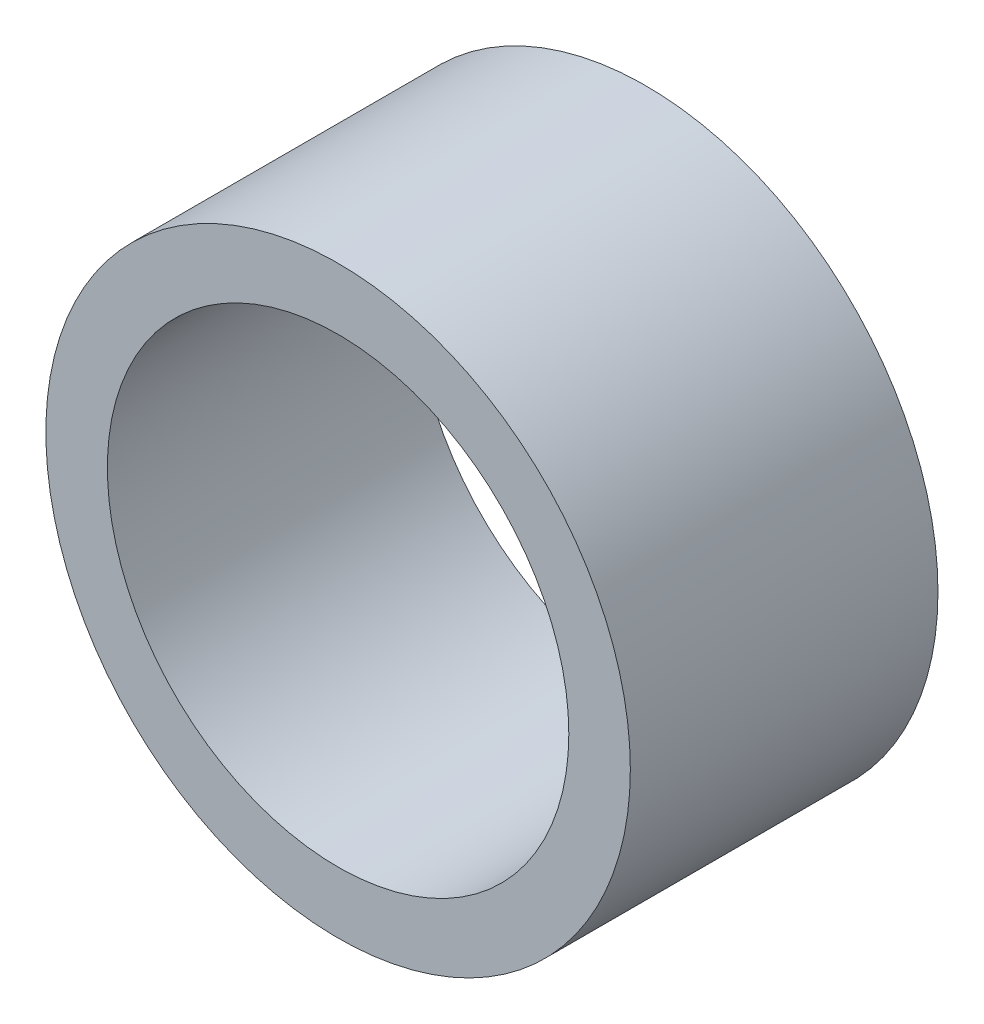
ISO-10303-21;
HEADER;
FILE_DESCRIPTION(('STEP AP214'),'2;1');
FILE_NAME('part.step','',(''),(''),'','','');
FILE_SCHEMA(('AUTOMOTIVE_DESIGN { 1 0 10303 214 1 1 1 1 }'));
ENDSEC;
DATA;
#1=APPLICATION_CONTEXT('core data for automotive mechanical design processes');
#2=APPLICATION_PROTOCOL_DEFINITION('international standard','automotive_design',2000,#1);
#3=PRODUCT_CONTEXT('',#1,'mechanical');
#4=PRODUCT('Part','Part','',(#3));
#5=PRODUCT_RELATED_PRODUCT_CATEGORY('part','',(#4));
#6=PRODUCT_DEFINITION_FORMATION('','',#4);
#7=PRODUCT_DEFINITION_CONTEXT('part definition',#1,'design');
#8=PRODUCT_DEFINITION('design','',#6,#7);
#9=PRODUCT_DEFINITION_SHAPE('','',#8);
#10=(LENGTH_UNIT() NAMED_UNIT(*) SI_UNIT(.MILLI.,.METRE.));
#11=(NAMED_UNIT(*) PLANE_ANGLE_UNIT() SI_UNIT($,.RADIAN.));
#12=(NAMED_UNIT(*) SI_UNIT($,.STERADIAN.) SOLID_ANGLE_UNIT());
#13=UNCERTAINTY_MEASURE_WITH_UNIT(LENGTH_MEASURE(1.E-05),#10,'distance_accuracy_value','');
#14=(GEOMETRIC_REPRESENTATION_CONTEXT(3) GLOBAL_UNCERTAINTY_ASSIGNED_CONTEXT((#13)) GLOBAL_UNIT_ASSIGNED_CONTEXT((#10,
#11,#12)) REPRESENTATION_CONTEXT('',''));
#15=CARTESIAN_POINT('',(0.,0.,0.));
#16=DIRECTION('',(0.,0.,1.));
#17=DIRECTION('',(1.,0.,0.));
#18=AXIS2_PLACEMENT_3D('',#15,#16,#17);
#19=CARTESIAN_POINT('',(0.,0.,-50.));
#20=DIRECTION('',(0.,0.,1.));
#21=DIRECTION('',(-1.,0.,0.));
#22=AXIS2_PLACEMENT_3D('',#19,#20,#21);
#23=CYLINDRICAL_SURFACE('',#22,7.5);
#24=CARTESIAN_POINT('',(0.,0.,0.));
#25=DIRECTION('',(0.,0.,-1.));
#26=DIRECTION('',(-1.,0.,0.));
#27=AXIS2_PLACEMENT_3D('',#24,#25,#26);
#28=CIRCLE('',#27,7.5);
#29=CARTESIAN_POINT('',(7.5,0.,0.));
#30=VERTEX_POINT('',#29);
#31=EDGE_CURVE('E61',#30,#30,#28,.T.);
#32=ORIENTED_EDGE('',*,*,#31,.T.);
#33=DIRECTION('',(0.,0.,1.));
#34=VECTOR('',#33,1.);
#35=CARTESIAN_POINT('',(7.5,0.,-50.));
#36=LINE('',#35,#34);
#37=CARTESIAN_POINT('',(7.5,0.,10.));
#38=VERTEX_POINT('',#37);
#39=EDGE_CURVE('E11',#30,#38,#36,.T.);
#40=ORIENTED_EDGE('',*,*,#39,.T.);
#41=CARTESIAN_POINT('',(0.,0.,10.));
#42=DIRECTION('',(0.,0.,-1.));
#43=DIRECTION('',(-1.,0.,0.));
#44=AXIS2_PLACEMENT_3D('',#41,#42,#43);
#45=CIRCLE('',#44,7.5);
#46=EDGE_CURVE('E25',#38,#38,#45,.T.);
#47=ORIENTED_EDGE('',*,*,#46,.F.);
#48=ORIENTED_EDGE('',*,*,#39,.F.);
#49=EDGE_LOOP('',(#32,#40,#47,#48));
#50=FACE_BOUND('',#49,.T.);
#51=ADVANCED_FACE('F17',(#50),#23,.F.);
#52=CARTESIAN_POINT('',(-9.5,0.,10.));
#53=DIRECTION('',(0.,0.,1.));
#54=DIRECTION('',(1.,0.,0.));
#55=AXIS2_PLACEMENT_3D('',#52,#53,#54);
#56=PLANE('',#55);
#57=ORIENTED_EDGE('',*,*,#46,.T.);
#58=EDGE_LOOP('',(#57));
#59=FACE_BOUND('',#58,.T.);
#60=CARTESIAN_POINT('',(0.,0.,10.));
#61=DIRECTION('',(0.,0.,-1.));
#62=DIRECTION('',(-1.,0.,0.));
#63=AXIS2_PLACEMENT_3D('',#60,#61,#62);
#64=CIRCLE('',#63,9.5);
#65=CARTESIAN_POINT('',(9.5,0.,10.));
#66=VERTEX_POINT('',#65);
#67=EDGE_CURVE('E57',#66,#66,#64,.T.);
#68=ORIENTED_EDGE('',*,*,#67,.F.);
#69=EDGE_LOOP('',(#68));
#70=FACE_BOUND('',#69,.T.);
#71=ADVANCED_FACE('F74',(#59,#70),#56,.T.);
#72=CARTESIAN_POINT('',(0.,0.,-50.));
#73=DIRECTION('',(0.,0.,1.));
#74=DIRECTION('',(-1.,0.,0.));
#75=AXIS2_PLACEMENT_3D('',#72,#73,#74);
#76=CYLINDRICAL_SURFACE('',#75,9.5);
#77=ORIENTED_EDGE('',*,*,#67,.T.);
#78=DIRECTION('',(0.,0.,-1.));
#79=VECTOR('',#78,1.);
#80=CARTESIAN_POINT('',(9.5,0.,-50.));
#81=LINE('',#80,#79);
#82=CARTESIAN_POINT('',(9.5,0.,0.));
#83=VERTEX_POINT('',#82);
#84=EDGE_CURVE('E48',#66,#83,#81,.T.);
#85=ORIENTED_EDGE('',*,*,#84,.T.);
#86=CARTESIAN_POINT('',(0.,0.,0.));
#87=DIRECTION('',(0.,0.,-1.));
#88=DIRECTION('',(-1.,0.,0.));
#89=AXIS2_PLACEMENT_3D('',#86,#87,#88);
#90=CIRCLE('',#89,9.5);
#91=EDGE_CURVE('E53',#83,#83,#90,.T.);
#92=ORIENTED_EDGE('',*,*,#91,.F.);
#93=ORIENTED_EDGE('',*,*,#84,.F.);
#94=EDGE_LOOP('',(#77,#85,#92,#93));
#95=FACE_BOUND('',#94,.T.);
#96=ADVANCED_FACE('F52',(#95),#76,.T.);
#97=CARTESIAN_POINT('',(-7.5,0.,0.));
#98=DIRECTION('',(0.,0.,-1.));
#99=DIRECTION('',(0.,-1.,0.));
#100=AXIS2_PLACEMENT_3D('',#97,#98,#99);
#101=PLANE('',#100);
#102=ORIENTED_EDGE('',*,*,#31,.F.);
#103=EDGE_LOOP('',(#102));
#104=FACE_BOUND('',#103,.T.);
#105=ORIENTED_EDGE('',*,*,#91,.T.);
#106=EDGE_LOOP('',(#105));
#107=FACE_BOUND('',#106,.T.);
#108=ADVANCED_FACE('F56',(#104,#107),#101,.T.);
#109=CLOSED_SHELL('',(#51,#71,#96,#108));
#110=MANIFOLD_SOLID_BREP('B1',#109);
#111=ADVANCED_BREP_SHAPE_REPRESENTATION('',(#18,#110),#14);
#112=SHAPE_DEFINITION_REPRESENTATION(#9,#111);
ENDSEC;
END-ISO-10303-21;
